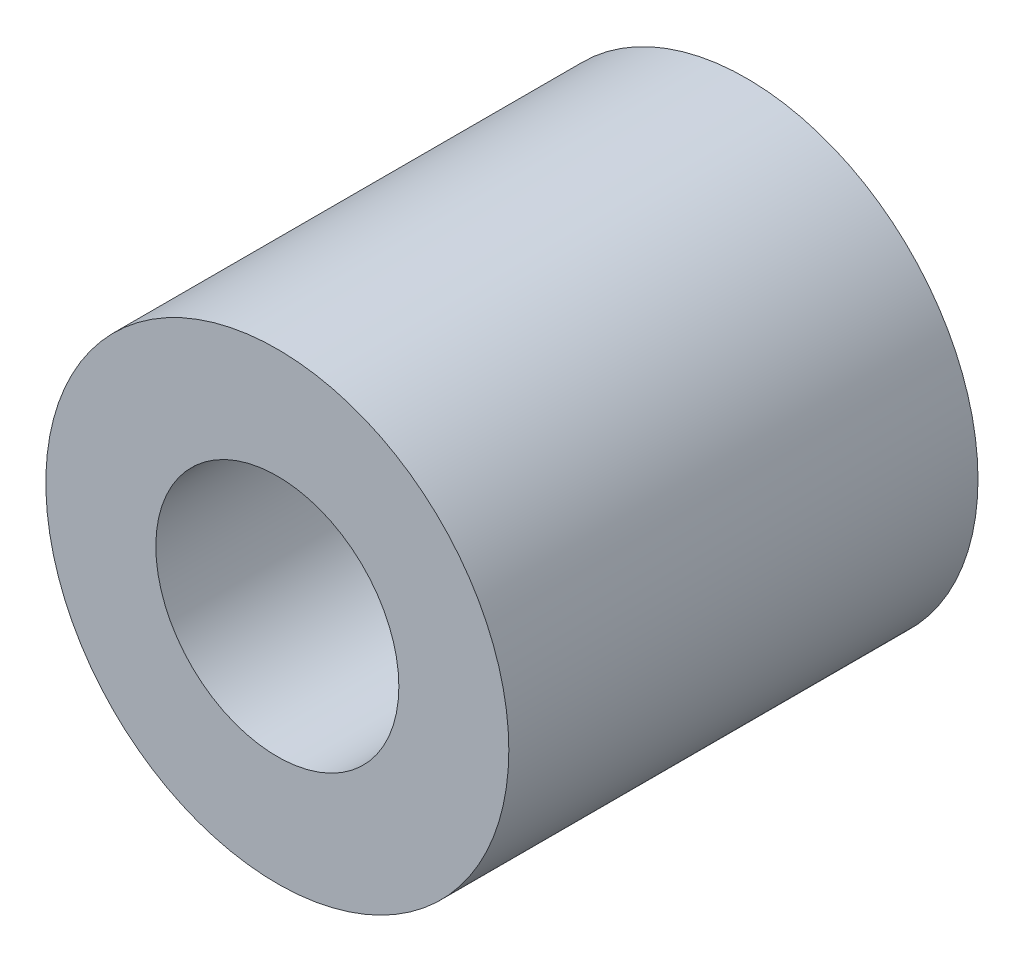
ISO-10303-21;
HEADER;
FILE_DESCRIPTION(('STEP AP214'),'2;1');
FILE_NAME('part.step','',(''),(''),'','','');
FILE_SCHEMA(('AUTOMOTIVE_DESIGN { 1 0 10303 214 1 1 1 1 }'));
ENDSEC;
DATA;
#1=APPLICATION_CONTEXT('core data for automotive mechanical design processes');
#2=APPLICATION_PROTOCOL_DEFINITION('international standard','automotive_design',2000,#1);
#3=PRODUCT_CONTEXT('',#1,'mechanical');
#4=PRODUCT('Part','Part','',(#3));
#5=PRODUCT_RELATED_PRODUCT_CATEGORY('part','',(#4));
#6=PRODUCT_DEFINITION_FORMATION('','',#4);
#7=PRODUCT_DEFINITION_CONTEXT('part definition',#1,'design');
#8=PRODUCT_DEFINITION('design','',#6,#7);
#9=PRODUCT_DEFINITION_SHAPE('','',#8);
#10=(LENGTH_UNIT() NAMED_UNIT(*) SI_UNIT(.MILLI.,.METRE.));
#11=(NAMED_UNIT(*) PLANE_ANGLE_UNIT() SI_UNIT($,.RADIAN.));
#12=(NAMED_UNIT(*) SI_UNIT($,.STERADIAN.) SOLID_ANGLE_UNIT());
#13=UNCERTAINTY_MEASURE_WITH_UNIT(LENGTH_MEASURE(1.E-05),#10,'distance_accuracy_value','');
#14=(GEOMETRIC_REPRESENTATION_CONTEXT(3) GLOBAL_UNCERTAINTY_ASSIGNED_CONTEXT((#13)) GLOBAL_UNIT_ASSIGNED_CONTEXT((#10,
#11,#12)) REPRESENTATION_CONTEXT('',''));
#15=CARTESIAN_POINT('',(0.,0.,0.));
#16=DIRECTION('',(0.,0.,1.));
#17=DIRECTION('',(1.,0.,0.));
#18=AXIS2_PLACEMENT_3D('',#15,#16,#17);
#19=CARTESIAN_POINT('',(0.,0.,9.));
#20=DIRECTION('',(0.,0.,1.));
#21=DIRECTION('',(1.,0.,0.));
#22=AXIS2_PLACEMENT_3D('',#19,#20,#21);
#23=PLANE('',#22);
#24=DIRECTION('',(-1.,0.,0.));
#25=VECTOR('',#24,1.);
#26=CARTESIAN_POINT('',(-1.5,2.,9.));
#27=LINE('',#26,#25);
#28=CARTESIAN_POINT('',(1.5,2.,9.));
#29=VERTEX_POINT('',#28);
#30=CARTESIAN_POINT('',(-1.5,2.,9.));
#31=VERTEX_POINT('',#30);
#32=EDGE_CURVE('E64',#29,#31,#27,.T.);
#33=ORIENTED_EDGE('',*,*,#32,.F.);
#34=CARTESIAN_POINT('',(0.,0.,9.));
#35=DIRECTION('',(0.,0.,1.));
#36=DIRECTION('',(1.,0.,0.));
#37=AXIS2_PLACEMENT_3D('',#34,#35,#36);
#38=CIRCLE('',#37,2.5);
#39=EDGE_CURVE('E50',#29,#31,#38,.T.);
#40=ORIENTED_EDGE('',*,*,#39,.T.);
#41=EDGE_LOOP('',(#33,#40));
#42=FACE_BOUND('',#41,.T.);
#43=ADVANCED_FACE('F35',(#42),#23,.T.);
#44=CARTESIAN_POINT('',(0.,0.,0.));
#45=DIRECTION('',(0.,0.,1.));
#46=DIRECTION('',(1.,0.,0.));
#47=AXIS2_PLACEMENT_3D('',#44,#45,#46);
#48=PLANE('',#47);
#49=CARTESIAN_POINT('',(0.,0.,0.));
#50=DIRECTION('',(0.,0.,1.));
#51=DIRECTION('',(1.,0.,0.));
#52=AXIS2_PLACEMENT_3D('',#49,#50,#51);
#53=CIRCLE('',#52,4.7625);
#54=CARTESIAN_POINT('',(4.7625,0.,0.));
#55=VERTEX_POINT('',#54);
#56=EDGE_CURVE('E11',#55,#55,#53,.T.);
#57=ORIENTED_EDGE('',*,*,#56,.F.);
#58=EDGE_LOOP('',(#57));
#59=FACE_BOUND('',#58,.T.);
#60=CARTESIAN_POINT('',(0.,0.,0.));
#61=DIRECTION('',(0.,0.,1.));
#62=DIRECTION('',(1.,0.,0.));
#63=AXIS2_PLACEMENT_3D('',#60,#61,#62);
#64=CIRCLE('',#63,2.5);
#65=CARTESIAN_POINT('',(-1.5,2.,0.));
#66=VERTEX_POINT('',#65);
#67=CARTESIAN_POINT('',(1.5,2.,0.));
#68=VERTEX_POINT('',#67);
#69=EDGE_CURVE('E55',#66,#68,#64,.T.);
#70=ORIENTED_EDGE('',*,*,#69,.T.);
#71=DIRECTION('',(-1.,0.,0.));
#72=VECTOR('',#71,1.);
#73=CARTESIAN_POINT('',(-1.5,2.,0.));
#74=LINE('',#73,#72);
#75=EDGE_CURVE('E71',#68,#66,#74,.T.);
#76=ORIENTED_EDGE('',*,*,#75,.T.);
#77=EDGE_LOOP('',(#70,#76));
#78=FACE_BOUND('',#77,.T.);
#79=ADVANCED_FACE('F94',(#59,#78),#48,.F.);
#80=CARTESIAN_POINT('',(0.,0.,9.));
#81=DIRECTION('',(0.,0.,-1.));
#82=DIRECTION('',(-1.,0.,0.));
#83=AXIS2_PLACEMENT_3D('',#80,#81,#82);
#84=CYLINDRICAL_SURFACE('',#83,4.7625);
#85=ORIENTED_EDGE('',*,*,#56,.T.);
#86=EDGE_LOOP('',(#85));
#87=FACE_BOUND('',#86,.T.);
#88=CARTESIAN_POINT('',(0.,0.,9.652));
#89=DIRECTION('',(0.,0.,1.));
#90=DIRECTION('',(1.,0.,0.));
#91=AXIS2_PLACEMENT_3D('',#88,#89,#90);
#92=CIRCLE('',#91,4.7625);
#93=CARTESIAN_POINT('',(4.7625,0.,9.652));
#94=VERTEX_POINT('',#93);
#95=EDGE_CURVE('E78',#94,#94,#92,.T.);
#96=ORIENTED_EDGE('',*,*,#95,.F.);
#97=EDGE_LOOP('',(#96));
#98=FACE_BOUND('',#97,.T.);
#99=ADVANCED_FACE('F37',(#87,#98),#84,.T.);
#100=CARTESIAN_POINT('',(0.,0.,9.));
#101=DIRECTION('',(0.,0.,-1.));
#102=DIRECTION('',(-1.,0.,0.));
#103=AXIS2_PLACEMENT_3D('',#100,#101,#102);
#104=CYLINDRICAL_SURFACE('',#103,2.5);
#105=ORIENTED_EDGE('',*,*,#69,.F.);
#106=DIRECTION('',(0.,0.,-1.));
#107=VECTOR('',#106,1.);
#108=CARTESIAN_POINT('',(-1.5,2.,9.));
#109=LINE('',#108,#107);
#110=EDGE_CURVE('E69',#31,#66,#109,.T.);
#111=ORIENTED_EDGE('',*,*,#110,.F.);
#112=ORIENTED_EDGE('',*,*,#39,.F.);
#113=DIRECTION('',(0.,0.,-1.));
#114=VECTOR('',#113,1.);
#115=CARTESIAN_POINT('',(1.5,2.,9.));
#116=LINE('',#115,#114);
#117=EDGE_CURVE('E43',#29,#68,#116,.T.);
#118=ORIENTED_EDGE('',*,*,#117,.T.);
#119=EDGE_LOOP('',(#105,#111,#112,#118));
#120=FACE_BOUND('',#119,.T.);
#121=CARTESIAN_POINT('',(0.,0.,9.652));
#122=DIRECTION('',(0.,0.,1.));
#123=DIRECTION('',(1.,0.,0.));
#124=AXIS2_PLACEMENT_3D('',#121,#122,#123);
#125=CIRCLE('',#124,2.5);
#126=CARTESIAN_POINT('',(2.5,0.,9.652));
#127=VERTEX_POINT('',#126);
#128=EDGE_CURVE('E65',#127,#127,#125,.T.);
#129=ORIENTED_EDGE('',*,*,#128,.T.);
#130=EDGE_LOOP('',(#129));
#131=FACE_BOUND('',#130,.T.);
#132=ADVANCED_FACE('F73',(#120,#131),#104,.F.);
#133=CARTESIAN_POINT('',(-1.5,2.,9.));
#134=DIRECTION('',(0.,-1.,0.));
#135=DIRECTION('',(0.,0.,-1.));
#136=AXIS2_PLACEMENT_3D('',#133,#134,#135);
#137=PLANE('',#136);
#138=ORIENTED_EDGE('',*,*,#75,.F.);
#139=ORIENTED_EDGE('',*,*,#117,.F.);
#140=ORIENTED_EDGE('',*,*,#32,.T.);
#141=ORIENTED_EDGE('',*,*,#110,.T.);
#142=EDGE_LOOP('',(#138,#139,#140,#141));
#143=FACE_BOUND('',#142,.T.);
#144=ADVANCED_FACE('F68',(#143),#137,.T.);
#145=CARTESIAN_POINT('',(0.,0.,9.652));
#146=DIRECTION('',(0.,0.,1.));
#147=DIRECTION('',(1.,0.,0.));
#148=AXIS2_PLACEMENT_3D('',#145,#146,#147);
#149=PLANE('',#148);
#150=ORIENTED_EDGE('',*,*,#95,.T.);
#151=EDGE_LOOP('',(#150));
#152=FACE_BOUND('',#151,.T.);
#153=ORIENTED_EDGE('',*,*,#128,.F.);
#154=EDGE_LOOP('',(#153));
#155=FACE_BOUND('',#154,.T.);
#156=ADVANCED_FACE('F85',(#152,#155),#149,.T.);
#157=CLOSED_SHELL('',(#43,#79,#99,#132,#144,#156));
#158=MANIFOLD_SOLID_BREP('B2',#157);
#159=ADVANCED_BREP_SHAPE_REPRESENTATION('',(#18,#158),#14);
#160=SHAPE_DEFINITION_REPRESENTATION(#9,#159);
ENDSEC;
END-ISO-10303-21;
